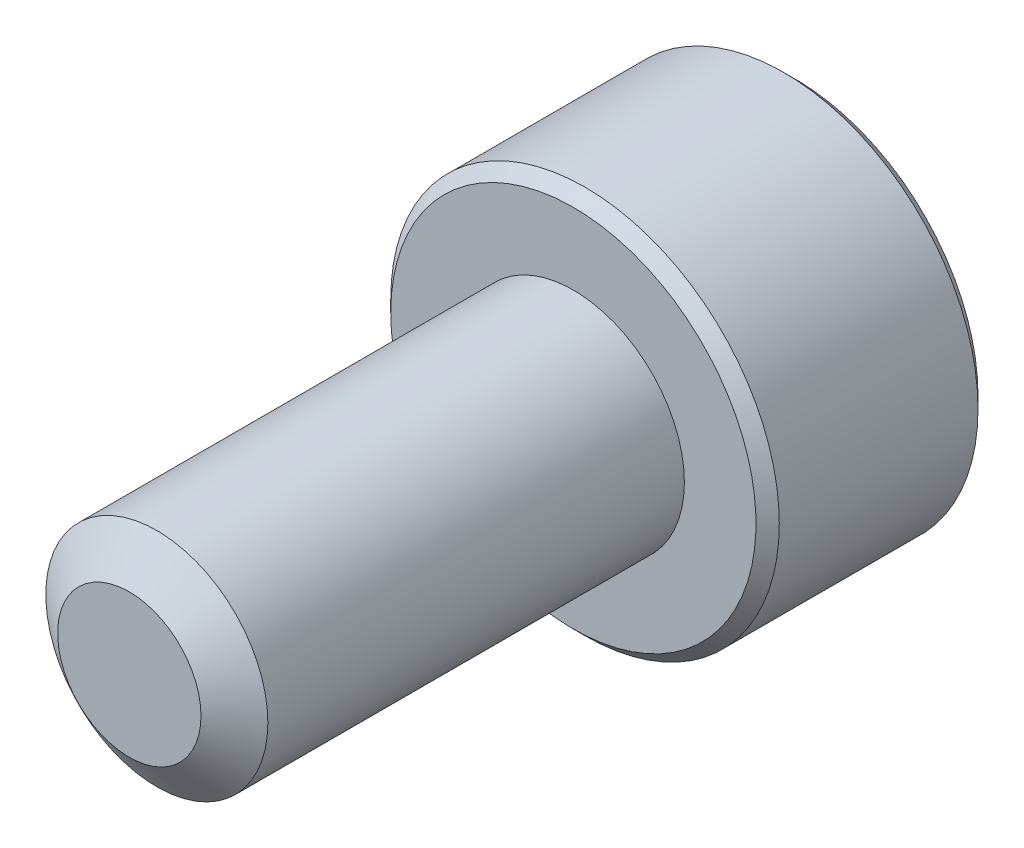
ISO-10303-21;
HEADER;
FILE_DESCRIPTION(('STEP AP214'),'2;1');
FILE_NAME('part.step','',(''),(''),'','','');
FILE_SCHEMA(('AUTOMOTIVE_DESIGN { 1 0 10303 214 1 1 1 1 }'));
ENDSEC;
DATA;
#1=APPLICATION_CONTEXT('core data for automotive mechanical design processes');
#2=APPLICATION_PROTOCOL_DEFINITION('international standard','automotive_design',2000,#1);
#3=PRODUCT_CONTEXT('',#1,'mechanical');
#4=PRODUCT('Part','Part','',(#3));
#5=PRODUCT_RELATED_PRODUCT_CATEGORY('part','',(#4));
#6=PRODUCT_DEFINITION_FORMATION('','',#4);
#7=PRODUCT_DEFINITION_CONTEXT('part definition',#1,'design');
#8=PRODUCT_DEFINITION('design','',#6,#7);
#9=PRODUCT_DEFINITION_SHAPE('','',#8);
#10=(LENGTH_UNIT() NAMED_UNIT(*) SI_UNIT(.MILLI.,.METRE.));
#11=(NAMED_UNIT(*) PLANE_ANGLE_UNIT() SI_UNIT($,.RADIAN.));
#12=(NAMED_UNIT(*) SI_UNIT($,.STERADIAN.) SOLID_ANGLE_UNIT());
#13=UNCERTAINTY_MEASURE_WITH_UNIT(LENGTH_MEASURE(1.E-05),#10,'distance_accuracy_value','');
#14=(GEOMETRIC_REPRESENTATION_CONTEXT(3) GLOBAL_UNCERTAINTY_ASSIGNED_CONTEXT((#13)) GLOBAL_UNIT_ASSIGNED_CONTEXT((#10,
#11,#12)) REPRESENTATION_CONTEXT('',''));
#15=CARTESIAN_POINT('',(0.,0.,0.));
#16=DIRECTION('',(0.,0.,1.));
#17=DIRECTION('',(1.,0.,0.));
#18=AXIS2_PLACEMENT_3D('',#15,#16,#17);
#19=CARTESIAN_POINT('',(0.,0.,-8.));
#20=DIRECTION('',(0.,0.,1.));
#21=DIRECTION('',(1.,0.,0.));
#22=AXIS2_PLACEMENT_3D('',#19,#20,#21);
#23=CYLINDRICAL_SURFACE('',#22,2.);
#24=CARTESIAN_POINT('',(0.,0.,-0.496211410611026));
#25=DIRECTION('',(0.,0.,1.));
#26=DIRECTION('',(1.,0.,0.));
#27=AXIS2_PLACEMENT_3D('',#24,#25,#26);
#28=CIRCLE('',#27,2.);
#29=CARTESIAN_POINT('',(2.,0.,-0.496211410611026));
#30=VERTEX_POINT('',#29);
#31=EDGE_CURVE('E108',#30,#30,#28,.T.);
#32=ORIENTED_EDGE('',*,*,#31,.F.);
#33=EDGE_LOOP('',(#32));
#34=FACE_BOUND('',#33,.T.);
#35=CARTESIAN_POINT('',(0.,0.,-8.));
#36=DIRECTION('',(0.,0.,-1.));
#37=DIRECTION('',(-1.,0.,0.));
#38=AXIS2_PLACEMENT_3D('',#35,#36,#37);
#39=CIRCLE('',#38,2.);
#40=CARTESIAN_POINT('',(-2.,0.,-8.));
#41=VERTEX_POINT('',#40);
#42=EDGE_CURVE('E214',#41,#41,#39,.F.);
#43=ORIENTED_EDGE('',*,*,#42,.T.);
#44=EDGE_LOOP('',(#43));
#45=FACE_BOUND('',#44,.T.);
#46=ADVANCED_FACE('F34',(#34,#45),#23,.T.);
#47=CARTESIAN_POINT('',(0.,0.,0.));
#48=DIRECTION('',(0.,0.,-1.));
#49=DIRECTION('',(-1.,0.,0.));
#50=AXIS2_PLACEMENT_3D('',#47,#48,#49);
#51=CONICAL_SURFACE('',#50,1.29133666301317,0.959931088596884);
#52=ORIENTED_EDGE('',*,*,#31,.T.);
#53=EDGE_LOOP('',(#52));
#54=FACE_BOUND('',#53,.T.);
#55=CARTESIAN_POINT('',(0.,0.,0.));
#56=DIRECTION('',(0.,0.,1.));
#57=DIRECTION('',(1.,0.,0.));
#58=AXIS2_PLACEMENT_3D('',#55,#56,#57);
#59=CIRCLE('',#58,1.29133666301317);
#60=CARTESIAN_POINT('',(1.29133666301317,0.,0.));
#61=VERTEX_POINT('',#60);
#62=EDGE_CURVE('E212',#61,#61,#59,.T.);
#63=ORIENTED_EDGE('',*,*,#62,.F.);
#64=EDGE_LOOP('',(#63));
#65=FACE_BOUND('',#64,.T.);
#66=ADVANCED_FACE('F195',(#54,#65),#51,.T.);
#67=CARTESIAN_POINT('',(0.,0.,0.));
#68=DIRECTION('',(0.,0.,1.));
#69=DIRECTION('',(1.,0.,0.));
#70=AXIS2_PLACEMENT_3D('',#67,#68,#69);
#71=PLANE('',#70);
#72=ORIENTED_EDGE('',*,*,#62,.T.);
#73=EDGE_LOOP('',(#72));
#74=FACE_BOUND('',#73,.T.);
#75=ADVANCED_FACE('F192',(#74),#71,.T.);
#76=CARTESIAN_POINT('',(0.,0.,-12.));
#77=DIRECTION('',(0.,0.,1.));
#78=DIRECTION('',(1.,0.,0.));
#79=AXIS2_PLACEMENT_3D('',#76,#77,#78);
#80=CYLINDRICAL_SURFACE('',#79,3.5);
#81=CARTESIAN_POINT('',(0.,0.,-11.79));
#82=DIRECTION('',(0.,0.,-1.));
#83=DIRECTION('',(-1.,0.,0.));
#84=AXIS2_PLACEMENT_3D('',#81,#82,#83);
#85=CIRCLE('',#84,3.5);
#86=CARTESIAN_POINT('',(3.5,0.,-11.79));
#87=VERTEX_POINT('',#86);
#88=EDGE_CURVE('E42',#87,#87,#85,.F.);
#89=CARTESIAN_POINT('',(0.,0.,-8.21));
#90=DIRECTION('',(0.,0.,-1.));
#91=DIRECTION('',(-1.,0.,0.));
#92=AXIS2_PLACEMENT_3D('',#89,#90,#91);
#93=CIRCLE('',#92,3.5);
#94=CARTESIAN_POINT('',(3.5,0.,-8.21));
#95=VERTEX_POINT('',#94);
#96=EDGE_CURVE('E171',#95,#95,#93,.T.);
#97=CARTESIAN_POINT('',(3.5,0.,-11.79));
#98=CARTESIAN_POINT('',(3.5,0.,-11.7527083333333));
#99=CARTESIAN_POINT('',(3.5,0.,-11.7154166666667));
#100=CARTESIAN_POINT('',(3.5,0.,-11.6408333333333));
#101=CARTESIAN_POINT('',(3.5,0.,-11.6035416666667));
#102=CARTESIAN_POINT('',(3.5,0.,-11.5289583333333));
#103=CARTESIAN_POINT('',(3.5,0.,-11.4916666666667));
#104=CARTESIAN_POINT('',(3.5,0.,-11.4170833333333));
#105=CARTESIAN_POINT('',(3.5,0.,-11.3797916666667));
#106=CARTESIAN_POINT('',(3.5,0.,-11.3052083333333));
#107=CARTESIAN_POINT('',(3.5,0.,-11.2679166666667));
#108=CARTESIAN_POINT('',(3.5,0.,-11.1933333333333));
#109=CARTESIAN_POINT('',(3.5,0.,-11.1560416666667));
#110=CARTESIAN_POINT('',(3.5,0.,-11.0814583333333));
#111=CARTESIAN_POINT('',(3.5,0.,-11.0441666666667));
#112=CARTESIAN_POINT('',(3.5,0.,-10.9695833333333));
#113=CARTESIAN_POINT('',(3.5,0.,-10.9322916666667));
#114=CARTESIAN_POINT('',(3.5,0.,-10.8577083333333));
#115=CARTESIAN_POINT('',(3.5,0.,-10.8204166666667));
#116=CARTESIAN_POINT('',(3.5,0.,-10.7458333333333));
#117=CARTESIAN_POINT('',(3.5,0.,-10.7085416666667));
#118=CARTESIAN_POINT('',(3.5,0.,-10.6339583333333));
#119=CARTESIAN_POINT('',(3.5,0.,-10.5966666666667));
#120=CARTESIAN_POINT('',(3.5,0.,-10.5220833333333));
#121=CARTESIAN_POINT('',(3.5,0.,-10.4847916666667));
#122=CARTESIAN_POINT('',(3.5,0.,-10.4102083333333));
#123=CARTESIAN_POINT('',(3.5,0.,-10.3729166666667));
#124=CARTESIAN_POINT('',(3.5,0.,-10.2983333333333));
#125=CARTESIAN_POINT('',(3.5,0.,-10.2610416666667));
#126=CARTESIAN_POINT('',(3.5,0.,-10.1864583333333));
#127=CARTESIAN_POINT('',(3.5,0.,-10.1491666666667));
#128=CARTESIAN_POINT('',(3.5,0.,-10.0745833333333));
#129=CARTESIAN_POINT('',(3.5,0.,-10.0372916666667));
#130=CARTESIAN_POINT('',(3.5,0.,-9.96270833333333));
#131=CARTESIAN_POINT('',(3.5,0.,-9.92541666666667));
#132=CARTESIAN_POINT('',(3.5,0.,-9.85083333333333));
#133=CARTESIAN_POINT('',(3.5,0.,-9.81354166666667));
#134=CARTESIAN_POINT('',(3.5,0.,-9.73895833333333));
#135=CARTESIAN_POINT('',(3.5,0.,-9.70166666666667));
#136=CARTESIAN_POINT('',(3.5,0.,-9.62708333333333));
#137=CARTESIAN_POINT('',(3.5,0.,-9.58979166666667));
#138=CARTESIAN_POINT('',(3.5,0.,-9.51520833333333));
#139=CARTESIAN_POINT('',(3.5,0.,-9.47791666666667));
#140=CARTESIAN_POINT('',(3.5,0.,-9.40333333333333));
#141=CARTESIAN_POINT('',(3.5,0.,-9.36604166666667));
#142=CARTESIAN_POINT('',(3.5,0.,-9.29145833333333));
#143=CARTESIAN_POINT('',(3.5,0.,-9.25416666666667));
#144=CARTESIAN_POINT('',(3.5,0.,-9.17958333333333));
#145=CARTESIAN_POINT('',(3.5,0.,-9.14229166666667));
#146=CARTESIAN_POINT('',(3.5,0.,-9.06770833333333));
#147=CARTESIAN_POINT('',(3.5,0.,-9.03041666666667));
#148=CARTESIAN_POINT('',(3.5,0.,-8.95583333333333));
#149=CARTESIAN_POINT('',(3.5,0.,-8.91854166666667));
#150=CARTESIAN_POINT('',(3.5,0.,-8.84395833333333));
#151=CARTESIAN_POINT('',(3.5,0.,-8.80666666666667));
#152=CARTESIAN_POINT('',(3.5,0.,-8.73208333333334));
#153=CARTESIAN_POINT('',(3.5,0.,-8.69479166666667));
#154=CARTESIAN_POINT('',(3.5,0.,-8.62020833333333));
#155=CARTESIAN_POINT('',(3.5,0.,-8.58291666666667));
#156=CARTESIAN_POINT('',(3.5,0.,-8.50833333333333));
#157=CARTESIAN_POINT('',(3.5,0.,-8.47104166666667));
#158=CARTESIAN_POINT('',(3.5,0.,-8.39645833333333));
#159=CARTESIAN_POINT('',(3.5,0.,-8.35916666666667));
#160=CARTESIAN_POINT('',(3.5,0.,-8.28458333333334));
#161=CARTESIAN_POINT('',(3.5,0.,-8.24729166666667));
#162=CARTESIAN_POINT('',(3.5,0.,-8.21));
#163=B_SPLINE_CURVE_WITH_KNOTS('',3,(#97,#98,#99,#100,#101,#102,#103,#104,#105,#106,#107,#108,
#109,#110,#111,#112,#113,#114,#115,#116,#117,#118,#119,#120,#121,#122,#123,#124,#125,#126,#127,
#128,#129,#130,#131,#132,#133,#134,#135,#136,#137,#138,#139,#140,#141,#142,#143,#144,#145,#146,
#147,#148,#149,#150,#151,#152,#153,#154,#155,#156,#157,#158,#159,#160,#161,#162),.UNSPECIFIED.,
.F.,.F.,(4,2,2,2,2,2,2,2,2,2,2,2,2,2,2,2,2,2,2,2,2,2,2,2,2,2,2,2,2,2,2,2,4),(0.,
0.111875000000001,0.22375,0.335625000000001,0.4475,0.559375000000001,0.67125,0.783124999999999,
0.895,1.006875,1.11875,1.230625,1.3425,1.454375,1.56625,1.678125,1.79,1.901875,2.01375,2.125625,
2.2375,2.349375,2.46125,2.573125,2.685,2.796875,2.90875,3.020625,3.1325,3.244375,3.35625,
3.468125,3.58),.UNSPECIFIED.);
#164=EDGE_CURVE('BSEAM176',#87,#95,#163,.T.);
#165=ORIENTED_EDGE('',*,*,#88,.T.);
#166=ORIENTED_EDGE('',*,*,#96,.T.);
#167=ORIENTED_EDGE('',*,*,#164,.T.);
#168=ORIENTED_EDGE('',*,*,#164,.F.);
#169=EDGE_LOOP('',(#165,#167,#166,#168));
#170=FACE_BOUND('',#169,.T.);
#171=ADVANCED_FACE('F176',(#170),#80,.T.);
#172=CARTESIAN_POINT('',(0.,0.,-12.));
#173=DIRECTION('',(0.,0.,-1.));
#174=DIRECTION('',(-1.,0.,0.));
#175=AXIS2_PLACEMENT_3D('',#172,#173,#174);
#176=PLANE('',#175);
#177=CARTESIAN_POINT('',(0.,0.,-12.));
#178=DIRECTION('',(0.,0.,-1.));
#179=DIRECTION('',(-1.,0.,0.));
#180=AXIS2_PLACEMENT_3D('',#177,#178,#179);
#181=CIRCLE('',#180,3.29);
#182=CARTESIAN_POINT('',(3.29,0.,-12.));
#183=VERTEX_POINT('',#182);
#184=EDGE_CURVE('E107',#183,#183,#181,.T.);
#185=ORIENTED_EDGE('',*,*,#184,.T.);
#186=EDGE_LOOP('',(#185));
#187=FACE_BOUND('',#186,.T.);
#188=CARTESIAN_POINT('',(0.,0.,-12.));
#189=DIRECTION('',(0.,0.,-1.));
#190=DIRECTION('',(-1.,0.,0.));
#191=AXIS2_PLACEMENT_3D('',#188,#189,#190);
#192=CIRCLE('',#191,1.73205080756888);
#193=CARTESIAN_POINT('',(-1.5,0.866025403784442,-12.));
#194=VERTEX_POINT('',#193);
#195=CARTESIAN_POINT('',(0.,1.73205080756888,-12.));
#196=VERTEX_POINT('',#195);
#197=EDGE_CURVE('E88',#194,#196,#192,.T.);
#198=ORIENTED_EDGE('',*,*,#197,.F.);
#199=CARTESIAN_POINT('',(-1.5,-0.86602540378444,-12.));
#200=VERTEX_POINT('',#199);
#201=EDGE_CURVE('E48',#200,#194,#192,.T.);
#202=ORIENTED_EDGE('',*,*,#201,.F.);
#203=CARTESIAN_POINT('',(0.,-1.73205080756888,-12.));
#204=VERTEX_POINT('',#203);
#205=EDGE_CURVE('E274',#204,#200,#192,.T.);
#206=ORIENTED_EDGE('',*,*,#205,.F.);
#207=CARTESIAN_POINT('',(1.5,-0.866025403784441,-12.));
#208=VERTEX_POINT('',#207);
#209=EDGE_CURVE('E55',#208,#204,#192,.T.);
#210=ORIENTED_EDGE('',*,*,#209,.F.);
#211=CARTESIAN_POINT('',(1.5,0.866025403784441,-12.));
#212=VERTEX_POINT('',#211);
#213=EDGE_CURVE('E129',#212,#208,#192,.T.);
#214=ORIENTED_EDGE('',*,*,#213,.F.);
#215=EDGE_CURVE('E97',#196,#212,#192,.T.);
#216=ORIENTED_EDGE('',*,*,#215,.F.);
#217=EDGE_LOOP('',(#198,#202,#206,#210,#214,#216));
#218=FACE_BOUND('',#217,.T.);
#219=ADVANCED_FACE('F128',(#187,#218),#176,.T.);
#220=CARTESIAN_POINT('',(0.,0.,-8.));
#221=DIRECTION('',(0.,0.,-1.));
#222=DIRECTION('',(-1.,0.,0.));
#223=AXIS2_PLACEMENT_3D('',#220,#221,#222);
#224=PLANE('',#223);
#225=CARTESIAN_POINT('',(0.,0.,-8.));
#226=DIRECTION('',(0.,0.,-1.));
#227=DIRECTION('',(-1.,0.,0.));
#228=AXIS2_PLACEMENT_3D('',#225,#226,#227);
#229=CIRCLE('',#228,3.29);
#230=CARTESIAN_POINT('',(-3.29,0.,-8.));
#231=VERTEX_POINT('',#230);
#232=EDGE_CURVE('E11',#231,#231,#229,.F.);
#233=ORIENTED_EDGE('',*,*,#232,.T.);
#234=EDGE_LOOP('',(#233));
#235=FACE_BOUND('',#234,.T.);
#236=ORIENTED_EDGE('',*,*,#42,.F.);
#237=EDGE_LOOP('',(#236));
#238=FACE_BOUND('',#237,.T.);
#239=ADVANCED_FACE('F185',(#235,#238),#224,.F.);
#240=CARTESIAN_POINT('',(0.,0.,-12.));
#241=DIRECTION('',(0.,0.,-1.));
#242=DIRECTION('',(-1.,0.,0.));
#243=AXIS2_PLACEMENT_3D('',#240,#241,#242);
#244=CONICAL_SURFACE('',#243,1.73205080756888,0.78539816339745);
#245=ORIENTED_EDGE('',*,*,#215,.T.);
#246=CARTESIAN_POINT('',(-0.000199999999998815,1.73216627762271,-12.0001154816001));
#247=CARTESIAN_POINT('',(0.051367790737077,1.70239359975915,-11.9703654760673));
#248=CARTESIAN_POINT('',(0.103797917665202,1.67212305186355,-11.9423624839103));
#249=CARTESIAN_POINT('',(0.210709034055598,1.61039789003619,-11.8910892304401));
#250=CARTESIAN_POINT('',(0.265200195814662,1.57893740312614,-11.8678475050444));
#251=CARTESIAN_POINT('',(0.375079081357249,1.51549879897987,-11.8280337289922));
#252=CARTESIAN_POINT('',(0.4304388090952,1.4835368452681,-11.8113615856709));
#253=CARTESIAN_POINT('',(0.542377257477151,1.41890915196211,-11.7856744568181));
#254=CARTESIAN_POINT('',(0.598952556553009,1.38624538781118,-11.7766402904789));
#255=CARTESIAN_POINT('',(0.696455389516441,1.329952100953,-11.7684890812269));
#256=CARTESIAN_POINT('',(0.737256908280466,1.30639533311124,-11.7672822529892));
#257=CARTESIAN_POINT('',(0.818787969615858,1.25932335290193,-11.7693140571623));
#258=CARTESIAN_POINT('',(0.85951749431463,1.23580815085313,-11.7725536707483));
#259=CARTESIAN_POINT('',(0.940584402163416,1.18900414978427,-11.783291985982));
#260=CARTESIAN_POINT('',(0.980921384598289,1.1657155821172,-11.7907946530187));
#261=CARTESIAN_POINT('',(1.06091833691403,1.11952932016335,-11.8096516119283));
#262=CARTESIAN_POINT('',(1.10057800851621,1.09663179808786,-11.8210075570186));
#263=CARTESIAN_POINT('',(1.20216313477448,1.03798159809699,-11.8547216475927));
#264=CARTESIAN_POINT('',(1.26345855370969,1.00259267147465,-11.8796218490934));
#265=CARTESIAN_POINT('',(1.35358562846331,0.950557780604376,-11.9216566532716));
#266=CARTESIAN_POINT('',(1.38328513990772,0.933410759677149,-11.9364251535591));
#267=CARTESIAN_POINT('',(1.44213790138375,0.899432101996408,-11.9673105659402));
#268=CARTESIAN_POINT('',(1.47129140422064,0.882600319285711,-11.9834268341217));
#269=CARTESIAN_POINT('',(1.5002,0.865909933730602,-12.0001154816001));
#270=B_SPLINE_CURVE_WITH_KNOTS('',3,(#246,#247,#248,#249,#250,#251,#252,#253,#254,#255,#256,
#257,#258,#259,#260,#261,#262,#263,#264,#265,#266,#267,#268,#269),.UNSPECIFIED.,.F.,.F.,(4,2,2,
2,2,2,2,2,2,2,2,4),(0.,0.199829143693305,0.400822987382387,0.598623720538179,0.795926240188887,
0.937113067959879,1.07833105577193,1.21968061668222,1.36109089931054,1.58570969637565,
1.69770705470963,1.80965120737193),.UNSPECIFIED.);
#271=EDGE_CURVE('E102',#196,#212,#270,.T.);
#272=ORIENTED_EDGE('',*,*,#271,.F.);
#273=EDGE_LOOP('',(#245,#272));
#274=FACE_BOUND('',#273,.T.);
#275=ADVANCED_FACE('F103',(#274),#244,.F.);
#276=ORIENTED_EDGE('',*,*,#213,.T.);
#277=CARTESIAN_POINT('',(1.5,-1.72720812969692,-12.5555785162708));
#278=CARTESIAN_POINT('',(1.5,-1.68515175699268,-12.5238299078574));
#279=CARTESIAN_POINT('',(1.5,-1.64286104748673,-12.4923925938074));
#280=CARTESIAN_POINT('',(1.5,-1.55771581035942,-12.4302690875564));
#281=CARTESIAN_POINT('',(1.5,-1.51486114386668,-12.3995830858922));
#282=CARTESIAN_POINT('',(1.5,-1.3846813415127,-12.3084071924272));
#283=CARTESIAN_POINT('',(1.5,-1.29637976071654,-12.2492883434268));
#284=CARTESIAN_POINT('',(1.5,-1.11121478730467,-12.1332309963165));
#285=CARTESIAN_POINT('',(1.5,-1.01415038238167,-12.076609558733));
#286=CARTESIAN_POINT('',(1.5,-0.815173408897605,-11.9730368812657));
#287=CARTESIAN_POINT('',(1.5,-0.713278669253285,-11.9260530415417));
#288=CARTESIAN_POINT('',(1.5,-0.560333774943111,-11.8685726684308));
#289=CARTESIAN_POINT('',(1.5,-0.511547982948042,-11.8520753877572));
#290=CARTESIAN_POINT('',(1.5,-0.412798620136866,-11.822997512927));
#291=CARTESIAN_POINT('',(1.5,-0.362834968437563,-11.810417188594));
#292=CARTESIAN_POINT('',(1.5,-0.262863235444982,-11.7900361941468));
#293=CARTESIAN_POINT('',(1.5,-0.212872113808023,-11.782153632746));
#294=CARTESIAN_POINT('',(1.5,-0.112355243569546,-11.771322063969));
#295=CARTESIAN_POINT('',(1.5,-0.0618295883726283,-11.7683722085243));
#296=CARTESIAN_POINT('',(1.5,0.0374291733323834,-11.7676248577248));
#297=CARTESIAN_POINT('',(1.5,0.0861609672002981,-11.7696447335581));
#298=CARTESIAN_POINT('',(1.5,0.183206937768826,-11.7783225528968));
#299=CARTESIAN_POINT('',(1.5,0.231521073438268,-11.7849809469685));
#300=CARTESIAN_POINT('',(1.5,0.328199853425434,-11.8026852441226));
#301=CARTESIAN_POINT('',(1.5,0.376550616310327,-11.813805811257));
#302=CARTESIAN_POINT('',(1.5,0.472195697125597,-11.8398434140487));
#303=CARTESIAN_POINT('',(1.5,0.519490103092739,-11.8547601320409));
#304=CARTESIAN_POINT('',(1.5,0.668391282696623,-11.9073352235961));
#305=CARTESIAN_POINT('',(1.5,0.767878709508551,-11.950981287472));
#306=CARTESIAN_POINT('',(1.5,0.962179866690722,-12.0480229945931));
#307=CARTESIAN_POINT('',(1.5,1.05697519961444,-12.1014536650895));
#308=CARTESIAN_POINT('',(1.5,1.23814273533382,-12.2116858520046));
#309=CARTESIAN_POINT('',(1.5,1.32469942181289,-12.2681879206986));
#310=CARTESIAN_POINT('',(1.5,1.45222331290673,-12.3555343015787));
#311=CARTESIAN_POINT('',(1.5,1.49418091978755,-12.38495775868));
#312=CARTESIAN_POINT('',(1.5,1.57752272931476,-12.4445828218305));
#313=CARTESIAN_POINT('',(1.5,1.61890708647354,-12.4747842116644));
#314=CARTESIAN_POINT('',(1.5,1.66005278019494,-12.5053081786095));
#315=B_SPLINE_CURVE_WITH_KNOTS('',3,(#277,#278,#279,#280,#281,#282,#283,#284,#285,#286,#287,
#288,#289,#290,#291,#292,#293,#294,#295,#296,#297,#298,#299,#300,#301,#302,#303,#304,#305,#306,
#307,#308,#309,#310,#311,#312,#313,#314),.UNSPECIFIED.,.F.,.F.,(4,2,2,2,2,2,2,2,2,2,2,2,2,2,2,2,
2,2,4),(0.,0.158079548982668,0.316198780993941,0.634850417346958,0.971690311361509,
1.30737131660667,1.46173961127088,1.61611853740677,1.76772101421409,1.91929742368538,
2.065387412096,2.21149159305544,2.36014984633872,2.50879566386709,2.83376031422673,
3.15991186985651,3.46985601802197,3.62358896039973,3.7772796264207),.UNSPECIFIED.);
#316=EDGE_CURVE('E96',#212,#208,#315,.F.);
#317=ORIENTED_EDGE('',*,*,#316,.F.);
#318=EDGE_LOOP('',(#276,#317));
#319=FACE_BOUND('',#318,.T.);
#320=ADVANCED_FACE('F280',(#319),#244,.F.);
#321=ORIENTED_EDGE('',*,*,#209,.T.);
#322=CARTESIAN_POINT('',(1.5002,-0.865909933730601,-12.0001154816001));
#323=CARTESIAN_POINT('',(1.44863220926292,-0.895682611594166,-11.9703654760673));
#324=CARTESIAN_POINT('',(1.3962020823348,-0.925953159489765,-11.9423624839103));
#325=CARTESIAN_POINT('',(1.2892909659444,-0.987678321317123,-11.8910892304401));
#326=CARTESIAN_POINT('',(1.23479980418534,-1.01913880822717,-11.8678475050444));
#327=CARTESIAN_POINT('',(1.12492091864275,-1.08257741237344,-11.8280337289922));
#328=CARTESIAN_POINT('',(1.0695611909048,-1.11453936608521,-11.8113615856709));
#329=CARTESIAN_POINT('',(0.957622742522848,-1.1791670593912,-11.7856744568181));
#330=CARTESIAN_POINT('',(0.90104744344699,-1.21183082354213,-11.7766402904789));
#331=CARTESIAN_POINT('',(0.803544610483558,-1.26812411040032,-11.7684890812269));
#332=CARTESIAN_POINT('',(0.762743091719533,-1.29168087824208,-11.7672822529892));
#333=CARTESIAN_POINT('',(0.681212030384141,-1.33875285845138,-11.7693140571623));
#334=CARTESIAN_POINT('',(0.640482505685369,-1.36226806050018,-11.7725536707483));
#335=CARTESIAN_POINT('',(0.559415597836583,-1.40907206156905,-11.783291985982));
#336=CARTESIAN_POINT('',(0.519078615401711,-1.43236062923612,-11.7907946530187));
#337=CARTESIAN_POINT('',(0.439081663085969,-1.47854689118996,-11.8096516119283));
#338=CARTESIAN_POINT('',(0.399421991483792,-1.50144441326545,-11.8210075570186));
#339=CARTESIAN_POINT('',(0.297836865225514,-1.56009461325633,-11.8547216475927));
#340=CARTESIAN_POINT('',(0.23654144629031,-1.59548353987866,-11.8796218490934));
#341=CARTESIAN_POINT('',(0.146414371536685,-1.64751843074894,-11.9216566532716));
#342=CARTESIAN_POINT('',(0.116714860092281,-1.66466545167617,-11.9364251535591));
#343=CARTESIAN_POINT('',(0.0578620986162475,-1.69864410935691,-11.9673105659402));
#344=CARTESIAN_POINT('',(0.0287085957793614,-1.71547589206761,-11.9834268341217));
#345=CARTESIAN_POINT('',(-0.000200000000001163,-1.73216627762271,-12.0001154816001));
#346=B_SPLINE_CURVE_WITH_KNOTS('',3,(#322,#323,#324,#325,#326,#327,#328,#329,#330,#331,#332,
#333,#334,#335,#336,#337,#338,#339,#340,#341,#342,#343,#344,#345),.UNSPECIFIED.,.F.,.F.,(4,2,2,
2,2,2,2,2,2,2,2,4),(0.,0.199829143693304,0.400822987382388,0.59862372053818,0.795926240188888,
0.93711306795988,1.07833105577193,1.21968061668222,1.36109089931054,1.58570969637565,
1.69770705470964,1.80965120737194),.UNSPECIFIED.);
#347=EDGE_CURVE('E139',#208,#204,#346,.T.);
#348=ORIENTED_EDGE('',*,*,#347,.F.);
#349=EDGE_LOOP('',(#321,#348));
#350=FACE_BOUND('',#349,.T.);
#351=ADVANCED_FACE('F277',(#350),#244,.F.);
#352=ORIENTED_EDGE('',*,*,#205,.T.);
#353=CARTESIAN_POINT('',(0.000199999999999467,-1.73216627762271,-12.0001154816001));
#354=CARTESIAN_POINT('',(-0.0513677907370762,-1.70239359975915,-11.9703654760673));
#355=CARTESIAN_POINT('',(-0.103797917665201,-1.67212305186355,-11.9423624839103));
#356=CARTESIAN_POINT('',(-0.210709034055597,-1.61039789003619,-11.8910892304401));
#357=CARTESIAN_POINT('',(-0.265200195814661,-1.57893740312614,-11.8678475050444));
#358=CARTESIAN_POINT('',(-0.375079081357249,-1.51549879897987,-11.8280337289922));
#359=CARTESIAN_POINT('',(-0.4304388090952,-1.4835368452681,-11.8113615856709));
#360=CARTESIAN_POINT('',(-0.542377257477151,-1.41890915196211,-11.7856744568181));
#361=CARTESIAN_POINT('',(-0.598952556553009,-1.38624538781118,-11.7766402904789));
#362=CARTESIAN_POINT('',(-0.696455389516441,-1.32995210095299,-11.7684890812269));
#363=CARTESIAN_POINT('',(-0.737256908280467,-1.30639533311124,-11.7672822529892));
#364=CARTESIAN_POINT('',(-0.818787969615859,-1.25932335290193,-11.7693140571623));
#365=CARTESIAN_POINT('',(-0.859517494314631,-1.23580815085313,-11.7725536707483));
#366=CARTESIAN_POINT('',(-0.940584402163417,-1.18900414978427,-11.783291985982));
#367=CARTESIAN_POINT('',(-0.980921384598289,-1.16571558211719,-11.7907946530187));
#368=CARTESIAN_POINT('',(-1.06091833691403,-1.11952932016335,-11.8096516119283));
#369=CARTESIAN_POINT('',(-1.10057800851621,-1.09663179808786,-11.8210075570186));
#370=CARTESIAN_POINT('',(-1.20216313477449,-1.03798159809698,-11.8547216475927));
#371=CARTESIAN_POINT('',(-1.26345855370969,-1.00259267147465,-11.8796218490934));
#372=CARTESIAN_POINT('',(-1.35358562846331,-0.950557780604376,-11.9216566532716));
#373=CARTESIAN_POINT('',(-1.38328513990772,-0.933410759677149,-11.9364251535591));
#374=CARTESIAN_POINT('',(-1.44213790138375,-0.899432101996408,-11.9673105659402));
#375=CARTESIAN_POINT('',(-1.47129140422064,-0.882600319285712,-11.9834268341217));
#376=CARTESIAN_POINT('',(-1.5002,-0.865909933730603,-12.0001154816001));
#377=B_SPLINE_CURVE_WITH_KNOTS('',3,(#353,#354,#355,#356,#357,#358,#359,#360,#361,#362,#363,
#364,#365,#366,#367,#368,#369,#370,#371,#372,#373,#374,#375,#376),.UNSPECIFIED.,.F.,.F.,(4,2,2,
2,2,2,2,2,2,2,2,4),(0.,0.199829143693304,0.400822987382389,0.598623720538181,0.795926240188889,
0.937113067959881,1.07833105577193,1.21968061668222,1.36109089931055,1.58570969637565,
1.69770705470963,1.80965120737193),.UNSPECIFIED.);
#378=EDGE_CURVE('E251',#204,#200,#377,.T.);
#379=ORIENTED_EDGE('',*,*,#378,.F.);
#380=EDGE_LOOP('',(#352,#379));
#381=FACE_BOUND('',#380,.T.);
#382=ADVANCED_FACE('F276',(#381),#244,.F.);
#383=ORIENTED_EDGE('',*,*,#201,.T.);
#384=CARTESIAN_POINT('',(-1.5,-1.72720812969693,-12.5555785162708));
#385=CARTESIAN_POINT('',(-1.5,-1.68515175699268,-12.5238299078574));
#386=CARTESIAN_POINT('',(-1.5,-1.64286104748674,-12.4923925938074));
#387=CARTESIAN_POINT('',(-1.5,-1.55771581035942,-12.4302690875564));
#388=CARTESIAN_POINT('',(-1.5,-1.51486114386669,-12.3995830858922));
#389=CARTESIAN_POINT('',(-1.5,-1.38468134151271,-12.3084071924272));
#390=CARTESIAN_POINT('',(-1.5,-1.29637976071654,-12.2492883434268));
#391=CARTESIAN_POINT('',(-1.5,-1.11121478730467,-12.1332309963165));
#392=CARTESIAN_POINT('',(-1.5,-1.01415038238168,-12.076609558733));
#393=CARTESIAN_POINT('',(-1.5,-0.815173408897607,-11.9730368812657));
#394=CARTESIAN_POINT('',(-1.5,-0.713278669253287,-11.9260530415417));
#395=CARTESIAN_POINT('',(-1.5,-0.560333774943113,-11.8685726684308));
#396=CARTESIAN_POINT('',(-1.5,-0.511547982948043,-11.8520753877572));
#397=CARTESIAN_POINT('',(-1.5,-0.412798620136868,-11.822997512927));
#398=CARTESIAN_POINT('',(-1.5,-0.362834968437564,-11.810417188594));
#399=CARTESIAN_POINT('',(-1.5,-0.262863235444983,-11.7900361941468));
#400=CARTESIAN_POINT('',(-1.5,-0.212872113808024,-11.782153632746));
#401=CARTESIAN_POINT('',(-1.5,-0.112355243569547,-11.771322063969));
#402=CARTESIAN_POINT('',(-1.5,-0.0618295883726293,-11.7683722085243));
#403=CARTESIAN_POINT('',(-1.5,0.0374291733323829,-11.7676248577248));
#404=CARTESIAN_POINT('',(-1.5,0.086160967200298,-11.7696447335581));
#405=CARTESIAN_POINT('',(-1.5,0.183206937768826,-11.7783225528968));
#406=CARTESIAN_POINT('',(-1.5,0.231521073438268,-11.7849809469685));
#407=CARTESIAN_POINT('',(-1.5,0.328199853425435,-11.8026852441226));
#408=CARTESIAN_POINT('',(-1.5,0.376550616310327,-11.813805811257));
#409=CARTESIAN_POINT('',(-1.5,0.472195697125597,-11.8398434140487));
#410=CARTESIAN_POINT('',(-1.5,0.51949010309274,-11.8547601320409));
#411=CARTESIAN_POINT('',(-1.5,0.668391282696623,-11.9073352235961));
#412=CARTESIAN_POINT('',(-1.5,0.767878709508551,-11.950981287472));
#413=CARTESIAN_POINT('',(-1.5,0.962179866690722,-12.0480229945931));
#414=CARTESIAN_POINT('',(-1.5,1.05697519961444,-12.1014536650895));
#415=CARTESIAN_POINT('',(-1.5,1.23814273533382,-12.2116858520046));
#416=CARTESIAN_POINT('',(-1.5,1.32469942181289,-12.2681879206986));
#417=CARTESIAN_POINT('',(-1.5,1.45222331290673,-12.3555343015787));
#418=CARTESIAN_POINT('',(-1.5,1.49418091978755,-12.38495775868));
#419=CARTESIAN_POINT('',(-1.5,1.57752272931476,-12.4445828218305));
#420=CARTESIAN_POINT('',(-1.5,1.61890708647354,-12.4747842116644));
#421=CARTESIAN_POINT('',(-1.5,1.66005278019494,-12.5053081786095));
#422=B_SPLINE_CURVE_WITH_KNOTS('',3,(#384,#385,#386,#387,#388,#389,#390,#391,#392,#393,#394,
#395,#396,#397,#398,#399,#400,#401,#402,#403,#404,#405,#406,#407,#408,#409,#410,#411,#412,#413,
#414,#415,#416,#417,#418,#419,#420,#421),.UNSPECIFIED.,.F.,.F.,(4,2,2,2,2,2,2,2,2,2,2,2,2,2,2,2,
2,2,4),(0.,0.158079548982669,0.316198780993944,0.634850417346961,0.971690311361514,
1.30737131660667,1.46173961127089,1.61611853740678,1.7677210142141,1.91929742368539,
2.06538741209601,2.21149159305545,2.36014984633873,2.5087956638671,2.83376031422674,
3.15991186985652,3.46985601802198,3.62358896039974,3.77727962642071),.UNSPECIFIED.);
#423=EDGE_CURVE('E118',#200,#194,#422,.T.);
#424=ORIENTED_EDGE('',*,*,#423,.F.);
#425=EDGE_LOOP('',(#383,#424));
#426=FACE_BOUND('',#425,.T.);
#427=ADVANCED_FACE('F289',(#426),#244,.F.);
#428=ORIENTED_EDGE('',*,*,#197,.T.);
#429=CARTESIAN_POINT('',(-1.5002,0.865909933730602,-12.0001154816001));
#430=CARTESIAN_POINT('',(-1.44863220926292,0.895682611594166,-11.9703654760673));
#431=CARTESIAN_POINT('',(-1.3962020823348,0.925953159489766,-11.9423624839103));
#432=CARTESIAN_POINT('',(-1.2892909659444,0.987678321317124,-11.8910892304401));
#433=CARTESIAN_POINT('',(-1.23479980418534,1.01913880822718,-11.8678475050444));
#434=CARTESIAN_POINT('',(-1.12492091864275,1.08257741237344,-11.8280337289922));
#435=CARTESIAN_POINT('',(-1.0695611909048,1.11453936608521,-11.8113615856709));
#436=CARTESIAN_POINT('',(-0.957622742522848,1.1791670593912,-11.7856744568181));
#437=CARTESIAN_POINT('',(-0.90104744344699,1.21183082354213,-11.7766402904789));
#438=CARTESIAN_POINT('',(-0.803544610483558,1.26812411040032,-11.7684890812269));
#439=CARTESIAN_POINT('',(-0.762743091719532,1.29168087824208,-11.7672822529892));
#440=CARTESIAN_POINT('',(-0.68121203038414,1.33875285845138,-11.7693140571623));
#441=CARTESIAN_POINT('',(-0.640482505685369,1.36226806050018,-11.7725536707483));
#442=CARTESIAN_POINT('',(-0.559415597836583,1.40907206156905,-11.783291985982));
#443=CARTESIAN_POINT('',(-0.519078615401711,1.43236062923612,-11.7907946530187));
#444=CARTESIAN_POINT('',(-0.439081663085968,1.47854689118996,-11.8096516119283));
#445=CARTESIAN_POINT('',(-0.399421991483791,1.50144441326545,-11.8210075570186));
#446=CARTESIAN_POINT('',(-0.297836865225514,1.56009461325633,-11.8547216475927));
#447=CARTESIAN_POINT('',(-0.23654144629031,1.59548353987866,-11.8796218490934));
#448=CARTESIAN_POINT('',(-0.146414371536685,1.64751843074894,-11.9216566532716));
#449=CARTESIAN_POINT('',(-0.116714860092281,1.66466545167617,-11.9364251535591));
#450=CARTESIAN_POINT('',(-0.0578620986162474,1.69864410935691,-11.9673105659402));
#451=CARTESIAN_POINT('',(-0.0287085957793612,1.71547589206761,-11.9834268341217));
#452=CARTESIAN_POINT('',(0.000200000000001217,1.73216627762271,-12.0001154816001));
#453=B_SPLINE_CURVE_WITH_KNOTS('',3,(#429,#430,#431,#432,#433,#434,#435,#436,#437,#438,#439,
#440,#441,#442,#443,#444,#445,#446,#447,#448,#449,#450,#451,#452),.UNSPECIFIED.,.F.,.F.,(4,2,2,
2,2,2,2,2,2,2,2,4),(0.,0.199829143693304,0.400822987382388,0.59862372053818,0.795926240188888,
0.93711306795988,1.07833105577193,1.21968061668222,1.36109089931054,1.58570969637565,
1.69770705470963,1.80965120737194),.UNSPECIFIED.);
#454=EDGE_CURVE('E92',#194,#196,#453,.T.);
#455=ORIENTED_EDGE('',*,*,#454,.F.);
#456=EDGE_LOOP('',(#428,#455));
#457=FACE_BOUND('',#456,.T.);
#458=ADVANCED_FACE('F90',(#457),#244,.F.);
#459=CARTESIAN_POINT('',(1.5,2.59807621135331,-9.75));
#460=DIRECTION('',(0.,0.,-1.));
#461=DIRECTION('',(-1.,0.,0.));
#462=AXIS2_PLACEMENT_3D('',#459,#460,#461);
#463=PLANE('',#462);
#464=DIRECTION('',(0.866025403784439,0.5,0.));
#465=VECTOR('',#464,1.);
#466=CARTESIAN_POINT('',(-1.5,0.86602540378444,-9.75));
#467=LINE('',#466,#465);
#468=CARTESIAN_POINT('',(-1.5,0.86602540378444,-9.75));
#469=VERTEX_POINT('',#468);
#470=CARTESIAN_POINT('',(0.,1.73205080756888,-9.75));
#471=VERTEX_POINT('',#470);
#472=EDGE_CURVE('E117',#469,#471,#467,.T.);
#473=ORIENTED_EDGE('',*,*,#472,.T.);
#474=DIRECTION('',(0.866025403784439,-0.5,0.));
#475=VECTOR('',#474,1.);
#476=CARTESIAN_POINT('',(0.,1.73205080756888,-9.75));
#477=LINE('',#476,#475);
#478=CARTESIAN_POINT('',(1.5,0.86602540378444,-9.75));
#479=VERTEX_POINT('',#478);
#480=EDGE_CURVE('E122',#471,#479,#477,.T.);
#481=ORIENTED_EDGE('',*,*,#480,.T.);
#482=DIRECTION('',(0.,-1.,0.));
#483=VECTOR('',#482,1.);
#484=CARTESIAN_POINT('',(1.5,0.86602540378444,-9.75));
#485=LINE('',#484,#483);
#486=CARTESIAN_POINT('',(1.5,-0.866025403784439,-9.75));
#487=VERTEX_POINT('',#486);
#488=EDGE_CURVE('E237',#479,#487,#485,.T.);
#489=ORIENTED_EDGE('',*,*,#488,.T.);
#490=DIRECTION('',(-0.866025403784439,-0.5,0.));
#491=VECTOR('',#490,1.);
#492=CARTESIAN_POINT('',(1.5,-0.866025403784439,-9.75));
#493=LINE('',#492,#491);
#494=CARTESIAN_POINT('',(0.,-1.73205080756888,-9.75));
#495=VERTEX_POINT('',#494);
#496=EDGE_CURVE('E234',#487,#495,#493,.T.);
#497=ORIENTED_EDGE('',*,*,#496,.T.);
#498=DIRECTION('',(-0.866025403784439,0.5,0.));
#499=VECTOR('',#498,1.);
#500=CARTESIAN_POINT('',(0.,-1.73205080756888,-9.75));
#501=LINE('',#500,#499);
#502=CARTESIAN_POINT('',(-1.5,-0.86602540378444,-9.75));
#503=VERTEX_POINT('',#502);
#504=EDGE_CURVE('E231',#495,#503,#501,.T.);
#505=ORIENTED_EDGE('',*,*,#504,.T.);
#506=DIRECTION('',(0.,1.,0.));
#507=VECTOR('',#506,1.);
#508=CARTESIAN_POINT('',(-1.5,-0.86602540378444,-9.75));
#509=LINE('',#508,#507);
#510=EDGE_CURVE('E125',#503,#469,#509,.T.);
#511=ORIENTED_EDGE('',*,*,#510,.T.);
#512=EDGE_LOOP('',(#473,#481,#489,#497,#505,#511));
#513=FACE_BOUND('',#512,.T.);
#514=ADVANCED_FACE('F159',(#513),#463,.T.);
#515=CARTESIAN_POINT('',(0.,1.73205080756888,-9.75));
#516=DIRECTION('',(0.5,0.866025403784439,0.));
#517=DIRECTION('',(-0.866025403784439,0.5,0.));
#518=AXIS2_PLACEMENT_3D('',#515,#516,#517);
#519=PLANE('',#518);
#520=DIRECTION('',(0.,0.,-1.));
#521=VECTOR('',#520,1.);
#522=CARTESIAN_POINT('',(0.,1.73205080756888,-9.75));
#523=LINE('',#522,#521);
#524=EDGE_CURVE('E114',#471,#196,#523,.T.);
#525=ORIENTED_EDGE('',*,*,#524,.T.);
#526=ORIENTED_EDGE('',*,*,#271,.T.);
#527=DIRECTION('',(0.,0.,-1.));
#528=VECTOR('',#527,1.);
#529=CARTESIAN_POINT('',(1.5,0.86602540378444,-9.75));
#530=LINE('',#529,#528);
#531=EDGE_CURVE('E124',#479,#212,#530,.T.);
#532=ORIENTED_EDGE('',*,*,#531,.F.);
#533=ORIENTED_EDGE('',*,*,#480,.F.);
#534=EDGE_LOOP('',(#525,#526,#532,#533));
#535=FACE_BOUND('',#534,.T.);
#536=ADVANCED_FACE('F120',(#535),#519,.F.);
#537=CARTESIAN_POINT('',(1.5,0.86602540378444,-9.75));
#538=DIRECTION('',(1.,0.,0.));
#539=DIRECTION('',(0.,1.,0.));
#540=AXIS2_PLACEMENT_3D('',#537,#538,#539);
#541=PLANE('',#540);
#542=ORIENTED_EDGE('',*,*,#531,.T.);
#543=ORIENTED_EDGE('',*,*,#316,.T.);
#544=DIRECTION('',(0.,0.,-1.));
#545=VECTOR('',#544,1.);
#546=CARTESIAN_POINT('',(1.5,-0.866025403784439,-9.75));
#547=LINE('',#546,#545);
#548=EDGE_CURVE('E220',#487,#208,#547,.T.);
#549=ORIENTED_EDGE('',*,*,#548,.F.);
#550=ORIENTED_EDGE('',*,*,#488,.F.);
#551=EDGE_LOOP('',(#542,#543,#549,#550));
#552=FACE_BOUND('',#551,.T.);
#553=ADVANCED_FACE('F148',(#552),#541,.F.);
#554=CARTESIAN_POINT('',(1.5,-0.866025403784439,-9.75));
#555=DIRECTION('',(0.5,-0.866025403784439,0.));
#556=DIRECTION('',(0.866025403784439,0.5,0.));
#557=AXIS2_PLACEMENT_3D('',#554,#555,#556);
#558=PLANE('',#557);
#559=ORIENTED_EDGE('',*,*,#548,.T.);
#560=ORIENTED_EDGE('',*,*,#347,.T.);
#561=DIRECTION('',(0.,0.,-1.));
#562=VECTOR('',#561,1.);
#563=CARTESIAN_POINT('',(0.,-1.73205080756888,-9.75));
#564=LINE('',#563,#562);
#565=EDGE_CURVE('E223',#495,#204,#564,.T.);
#566=ORIENTED_EDGE('',*,*,#565,.F.);
#567=ORIENTED_EDGE('',*,*,#496,.F.);
#568=EDGE_LOOP('',(#559,#560,#566,#567));
#569=FACE_BOUND('',#568,.T.);
#570=ADVANCED_FACE('F152',(#569),#558,.F.);
#571=CARTESIAN_POINT('',(0.,-1.73205080756888,-9.75));
#572=DIRECTION('',(-0.5,-0.866025403784439,0.));
#573=DIRECTION('',(0.866025403784439,-0.5,0.));
#574=AXIS2_PLACEMENT_3D('',#571,#572,#573);
#575=PLANE('',#574);
#576=ORIENTED_EDGE('',*,*,#565,.T.);
#577=ORIENTED_EDGE('',*,*,#378,.T.);
#578=DIRECTION('',(0.,0.,-1.));
#579=VECTOR('',#578,1.);
#580=CARTESIAN_POINT('',(-1.5,-0.86602540378444,-9.75));
#581=LINE('',#580,#579);
#582=EDGE_CURVE('E226',#503,#200,#581,.T.);
#583=ORIENTED_EDGE('',*,*,#582,.F.);
#584=ORIENTED_EDGE('',*,*,#504,.F.);
#585=EDGE_LOOP('',(#576,#577,#583,#584));
#586=FACE_BOUND('',#585,.T.);
#587=ADVANCED_FACE('F259',(#586),#575,.F.);
#588=CARTESIAN_POINT('',(-1.5,-0.86602540378444,-9.75));
#589=DIRECTION('',(-1.,0.,0.));
#590=DIRECTION('',(0.,-1.,0.));
#591=AXIS2_PLACEMENT_3D('',#588,#589,#590);
#592=PLANE('',#591);
#593=ORIENTED_EDGE('',*,*,#582,.T.);
#594=ORIENTED_EDGE('',*,*,#423,.T.);
#595=DIRECTION('',(0.,0.,-1.));
#596=VECTOR('',#595,1.);
#597=CARTESIAN_POINT('',(-1.5,0.86602540378444,-9.75));
#598=LINE('',#597,#596);
#599=EDGE_CURVE('E116',#469,#194,#598,.T.);
#600=ORIENTED_EDGE('',*,*,#599,.F.);
#601=ORIENTED_EDGE('',*,*,#510,.F.);
#602=EDGE_LOOP('',(#593,#594,#600,#601));
#603=FACE_BOUND('',#602,.T.);
#604=ADVANCED_FACE('F256',(#603),#592,.F.);
#605=CARTESIAN_POINT('',(-1.5,0.86602540378444,-9.75));
#606=DIRECTION('',(-0.5,0.866025403784439,0.));
#607=DIRECTION('',(-0.866025403784439,-0.5,0.));
#608=AXIS2_PLACEMENT_3D('',#605,#606,#607);
#609=PLANE('',#608);
#610=ORIENTED_EDGE('',*,*,#599,.T.);
#611=ORIENTED_EDGE('',*,*,#454,.T.);
#612=ORIENTED_EDGE('',*,*,#524,.F.);
#613=ORIENTED_EDGE('',*,*,#472,.F.);
#614=EDGE_LOOP('',(#610,#611,#612,#613));
#615=FACE_BOUND('',#614,.T.);
#616=ADVANCED_FACE('F112',(#615),#609,.F.);
#617=CARTESIAN_POINT('',(0.,0.,-12.));
#618=DIRECTION('',(0.,0.,1.));
#619=DIRECTION('',(1.,0.,0.));
#620=AXIS2_PLACEMENT_3D('',#617,#618,#619);
#621=CONICAL_SURFACE('',#620,3.29,0.785398163397448);
#622=CARTESIAN_POINT('',(3.5,0.,-11.79));
#623=CARTESIAN_POINT('',(3.4978125,0.,-11.7921875));
#624=CARTESIAN_POINT('',(3.495625,0.,-11.794375));
#625=CARTESIAN_POINT('',(3.49125,0.,-11.79875));
#626=CARTESIAN_POINT('',(3.4890625,0.,-11.8009375));
#627=CARTESIAN_POINT('',(3.4846875,0.,-11.8053125));
#628=CARTESIAN_POINT('',(3.4825,0.,-11.8075));
#629=CARTESIAN_POINT('',(3.478125,0.,-11.811875));
#630=CARTESIAN_POINT('',(3.4759375,0.,-11.8140625));
#631=CARTESIAN_POINT('',(3.4715625,0.,-11.8184375));
#632=CARTESIAN_POINT('',(3.469375,0.,-11.820625));
#633=CARTESIAN_POINT('',(3.465,0.,-11.825));
#634=CARTESIAN_POINT('',(3.4628125,0.,-11.8271875));
#635=CARTESIAN_POINT('',(3.4584375,0.,-11.8315625));
#636=CARTESIAN_POINT('',(3.45625,0.,-11.83375));
#637=CARTESIAN_POINT('',(3.451875,0.,-11.838125));
#638=CARTESIAN_POINT('',(3.4496875,0.,-11.8403125));
#639=CARTESIAN_POINT('',(3.4453125,0.,-11.8446875));
#640=CARTESIAN_POINT('',(3.443125,0.,-11.846875));
#641=CARTESIAN_POINT('',(3.43875,0.,-11.85125));
#642=CARTESIAN_POINT('',(3.4365625,0.,-11.8534375));
#643=CARTESIAN_POINT('',(3.4321875,0.,-11.8578125));
#644=CARTESIAN_POINT('',(3.43,0.,-11.86));
#645=CARTESIAN_POINT('',(3.425625,0.,-11.864375));
#646=CARTESIAN_POINT('',(3.4234375,0.,-11.8665625));
#647=CARTESIAN_POINT('',(3.4190625,0.,-11.8709375));
#648=CARTESIAN_POINT('',(3.416875,0.,-11.873125));
#649=CARTESIAN_POINT('',(3.4125,0.,-11.8775));
#650=CARTESIAN_POINT('',(3.4103125,0.,-11.8796875));
#651=CARTESIAN_POINT('',(3.4059375,0.,-11.8840625));
#652=CARTESIAN_POINT('',(3.40375,0.,-11.88625));
#653=CARTESIAN_POINT('',(3.399375,0.,-11.890625));
#654=CARTESIAN_POINT('',(3.3971875,0.,-11.8928125));
#655=CARTESIAN_POINT('',(3.3928125,0.,-11.8971875));
#656=CARTESIAN_POINT('',(3.390625,0.,-11.899375));
#657=CARTESIAN_POINT('',(3.38625,0.,-11.90375));
#658=CARTESIAN_POINT('',(3.3840625,0.,-11.9059375));
#659=CARTESIAN_POINT('',(3.3796875,0.,-11.9103125));
#660=CARTESIAN_POINT('',(3.3775,0.,-11.9125));
#661=CARTESIAN_POINT('',(3.373125,0.,-11.916875));
#662=CARTESIAN_POINT('',(3.3709375,0.,-11.9190625));
#663=CARTESIAN_POINT('',(3.3665625,0.,-11.9234375));
#664=CARTESIAN_POINT('',(3.364375,0.,-11.925625));
#665=CARTESIAN_POINT('',(3.36,0.,-11.93));
#666=CARTESIAN_POINT('',(3.3578125,0.,-11.9321875));
#667=CARTESIAN_POINT('',(3.3534375,0.,-11.9365625));
#668=CARTESIAN_POINT('',(3.35125,0.,-11.93875));
#669=CARTESIAN_POINT('',(3.346875,0.,-11.943125));
#670=CARTESIAN_POINT('',(3.3446875,0.,-11.9453125));
#671=CARTESIAN_POINT('',(3.3403125,0.,-11.9496875));
#672=CARTESIAN_POINT('',(3.338125,0.,-11.951875));
#673=CARTESIAN_POINT('',(3.33375,0.,-11.95625));
#674=CARTESIAN_POINT('',(3.3315625,0.,-11.9584375));
#675=CARTESIAN_POINT('',(3.3271875,0.,-11.9628125));
#676=CARTESIAN_POINT('',(3.325,0.,-11.965));
#677=CARTESIAN_POINT('',(3.320625,0.,-11.969375));
#678=CARTESIAN_POINT('',(3.3184375,0.,-11.9715625));
#679=CARTESIAN_POINT('',(3.3140625,0.,-11.9759375));
#680=CARTESIAN_POINT('',(3.311875,0.,-11.978125));
#681=CARTESIAN_POINT('',(3.3075,0.,-11.9825));
#682=CARTESIAN_POINT('',(3.3053125,0.,-11.9846875));
#683=CARTESIAN_POINT('',(3.3009375,0.,-11.9890625));
#684=CARTESIAN_POINT('',(3.29875,0.,-11.99125));
#685=CARTESIAN_POINT('',(3.294375,0.,-11.995625));
#686=CARTESIAN_POINT('',(3.2921875,0.,-11.9978125));
#687=CARTESIAN_POINT('',(3.29,0.,-12.));
#688=B_SPLINE_CURVE_WITH_KNOTS('',3,(#622,#623,#624,#625,#626,#627,#628,#629,#630,#631,#632,
#633,#634,#635,#636,#637,#638,#639,#640,#641,#642,#643,#644,#645,#646,#647,#648,#649,#650,#651,
#652,#653,#654,#655,#656,#657,#658,#659,#660,#661,#662,#663,#664,#665,#666,#667,#668,#669,#670,
#671,#672,#673,#674,#675,#676,#677,#678,#679,#680,#681,#682,#683,#684,#685,#686,#687),
.UNSPECIFIED.,.F.,.F.,(4,2,2,2,2,2,2,2,2,2,2,2,2,2,2,2,2,2,2,2,2,2,2,2,2,2,2,2,2,2,2,2,4),(0.,
0.00928077650307444,0.0185615530061476,0.0278423295092209,0.0371231060122941,0.0464038825153685,
0.0556846590184417,0.0649654355215149,0.0742462120245881,0.0835269885276626,0.0928077650307358,
0.102088541533809,0.111369318036882,0.120650094539957,0.12993087104303,0.139211647546103,
0.148492424049176,0.157773200552251,0.167053977055324,0.176334753558397,0.18561553006147,
0.194896306564545,0.204177083067618,0.213457859570691,0.222738636073766,0.232019412576839,
0.241300189079912,0.250580965582985,0.25986174208606,0.269142518589133,0.278423295092206,
0.287704071595279,0.296984848098354),.UNSPECIFIED.);
#689=EDGE_CURVE('BSEAM179',#87,#183,#688,.T.);
#690=ORIENTED_EDGE('',*,*,#88,.F.);
#691=ORIENTED_EDGE('',*,*,#184,.F.);
#692=ORIENTED_EDGE('',*,*,#689,.T.);
#693=ORIENTED_EDGE('',*,*,#689,.F.);
#694=EDGE_LOOP('',(#690,#692,#691,#693));
#695=FACE_BOUND('',#694,.T.);
#696=ADVANCED_FACE('F179',(#695),#621,.T.);
#697=CARTESIAN_POINT('',(0.,0.,-8.21));
#698=DIRECTION('',(0.,0.,-1.));
#699=DIRECTION('',(-1.,0.,0.));
#700=AXIS2_PLACEMENT_3D('',#697,#698,#699);
#701=CONICAL_SURFACE('',#700,3.5,0.785398163397447);
#702=ORIENTED_EDGE('',*,*,#232,.F.);
#703=EDGE_LOOP('',(#702));
#704=FACE_BOUND('',#703,.T.);
#705=ORIENTED_EDGE('',*,*,#96,.F.);
#706=EDGE_LOOP('',(#705));
#707=FACE_BOUND('',#706,.T.);
#708=ADVANCED_FACE('F36',(#704,#707),#701,.T.);
#709=CLOSED_SHELL('',(#46,#66,#75,#171,#219,#239,#275,#320,#351,#382,#427,#458,#514,#536,#553,
#570,#587,#604,#616,#696,#708));
#710=MANIFOLD_SOLID_BREP('B2',#709);
#711=ADVANCED_BREP_SHAPE_REPRESENTATION('',(#18,#710),#14);
#712=SHAPE_DEFINITION_REPRESENTATION(#9,#711);
ENDSEC;
END-ISO-10303-21;
